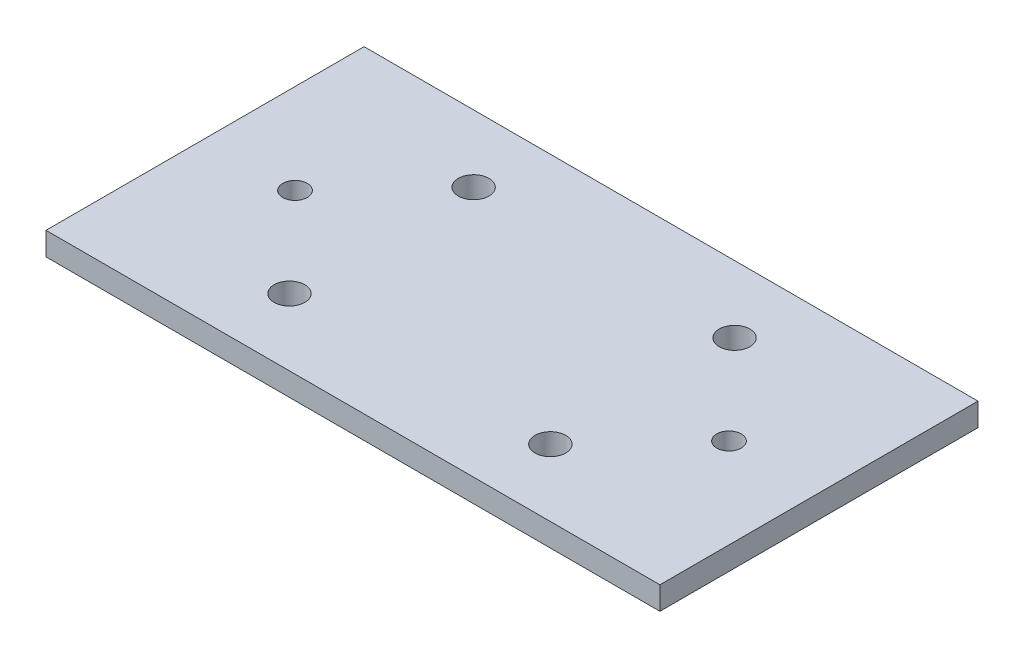
ISO-10303-21;
HEADER;
FILE_DESCRIPTION(('STEP AP214'),'2;1');
FILE_NAME('part.step','',(''),(''),'','','');
FILE_SCHEMA(('AUTOMOTIVE_DESIGN { 1 0 10303 214 1 1 1 1 }'));
ENDSEC;
DATA;
#1=APPLICATION_CONTEXT('core data for automotive mechanical design processes');
#2=APPLICATION_PROTOCOL_DEFINITION('international standard','automotive_design',2000,#1);
#3=PRODUCT_CONTEXT('',#1,'mechanical');
#4=PRODUCT('Part','Part','',(#3));
#5=PRODUCT_RELATED_PRODUCT_CATEGORY('part','',(#4));
#6=PRODUCT_DEFINITION_FORMATION('','',#4);
#7=PRODUCT_DEFINITION_CONTEXT('part definition',#1,'design');
#8=PRODUCT_DEFINITION('design','',#6,#7);
#9=PRODUCT_DEFINITION_SHAPE('','',#8);
#10=(LENGTH_UNIT() NAMED_UNIT(*) SI_UNIT(.MILLI.,.METRE.));
#11=(NAMED_UNIT(*) PLANE_ANGLE_UNIT() SI_UNIT($,.RADIAN.));
#12=(NAMED_UNIT(*) SI_UNIT($,.STERADIAN.) SOLID_ANGLE_UNIT());
#13=UNCERTAINTY_MEASURE_WITH_UNIT(LENGTH_MEASURE(1.E-05),#10,'distance_accuracy_value','');
#14=(GEOMETRIC_REPRESENTATION_CONTEXT(3) GLOBAL_UNCERTAINTY_ASSIGNED_CONTEXT((#13)) GLOBAL_UNIT_ASSIGNED_CONTEXT((#10,
#11,#12)) REPRESENTATION_CONTEXT('',''));
#15=CARTESIAN_POINT('',(0.,0.,0.));
#16=DIRECTION('',(0.,0.,1.));
#17=DIRECTION('',(1.,0.,0.));
#18=AXIS2_PLACEMENT_3D('',#15,#16,#17);
#19=CARTESIAN_POINT('',(0.,3.,0.));
#20=DIRECTION('',(0.,-1.,0.));
#21=DIRECTION('',(0.,0.,-1.));
#22=AXIS2_PLACEMENT_3D('',#19,#20,#21);
#23=PLANE('',#22);
#24=DIRECTION('',(0.,0.,1.));
#25=VECTOR('',#24,1.);
#26=CARTESIAN_POINT('',(0.,3.,0.));
#27=LINE('',#26,#25);
#28=CARTESIAN_POINT('',(0.,3.,-41.44902295419));
#29=VERTEX_POINT('',#28);
#30=CARTESIAN_POINT('',(0.,3.,0.));
#31=VERTEX_POINT('',#30);
#32=EDGE_CURVE('E96',#29,#31,#27,.T.);
#33=ORIENTED_EDGE('',*,*,#32,.T.);
#34=DIRECTION('',(1.,0.,0.));
#35=VECTOR('',#34,1.);
#36=CARTESIAN_POINT('',(0.,3.,0.));
#37=LINE('',#36,#35);
#38=CARTESIAN_POINT('',(80.,3.,0.));
#39=VERTEX_POINT('',#38);
#40=EDGE_CURVE('E91',#31,#39,#37,.T.);
#41=ORIENTED_EDGE('',*,*,#40,.T.);
#42=DIRECTION('',(0.,0.,-1.));
#43=VECTOR('',#42,1.);
#44=CARTESIAN_POINT('',(80.,3.,0.));
#45=LINE('',#44,#43);
#46=CARTESIAN_POINT('',(80.,3.,-41.44902295419));
#47=VERTEX_POINT('',#46);
#48=EDGE_CURVE('E94',#39,#47,#45,.T.);
#49=ORIENTED_EDGE('',*,*,#48,.T.);
#50=DIRECTION('',(-1.,0.,0.));
#51=VECTOR('',#50,1.);
#52=CARTESIAN_POINT('',(0.,3.,-41.44902295419));
#53=LINE('',#52,#51);
#54=EDGE_CURVE('E61',#47,#29,#53,.T.);
#55=ORIENTED_EDGE('',*,*,#54,.T.);
#56=EDGE_LOOP('',(#33,#41,#49,#55));
#57=FACE_BOUND('',#56,.T.);
#58=CARTESIAN_POINT('',(23.,3.,-32.724511477095));
#59=DIRECTION('',(0.,1.,0.));
#60=DIRECTION('',(0.,0.,1.));
#61=AXIS2_PLACEMENT_3D('',#58,#59,#60);
#62=CIRCLE('',#61,2.);
#63=CARTESIAN_POINT('',(23.,3.,-30.724511477095));
#64=VERTEX_POINT('',#63);
#65=EDGE_CURVE('E116',#64,#64,#62,.T.);
#66=ORIENTED_EDGE('',*,*,#65,.F.);
#67=EDGE_LOOP('',(#66));
#68=FACE_BOUND('',#67,.T.);
#69=CARTESIAN_POINT('',(57.,3.,-32.724511477095));
#70=DIRECTION('',(0.,1.,0.));
#71=DIRECTION('',(0.,0.,1.));
#72=AXIS2_PLACEMENT_3D('',#69,#70,#71);
#73=CIRCLE('',#72,2.);
#74=CARTESIAN_POINT('',(57.,3.,-30.724511477095));
#75=VERTEX_POINT('',#74);
#76=EDGE_CURVE('E138',#75,#75,#73,.T.);
#77=ORIENTED_EDGE('',*,*,#76,.F.);
#78=EDGE_LOOP('',(#77));
#79=FACE_BOUND('',#78,.T.);
#80=CARTESIAN_POINT('',(23.,3.,-8.72451147709501));
#81=DIRECTION('',(0.,1.,0.));
#82=DIRECTION('',(0.,0.,1.));
#83=AXIS2_PLACEMENT_3D('',#80,#81,#82);
#84=CIRCLE('',#83,2.);
#85=CARTESIAN_POINT('',(23.,3.,-6.72451147709501));
#86=VERTEX_POINT('',#85);
#87=EDGE_CURVE('E146',#86,#86,#84,.T.);
#88=ORIENTED_EDGE('',*,*,#87,.F.);
#89=EDGE_LOOP('',(#88));
#90=FACE_BOUND('',#89,.T.);
#91=CARTESIAN_POINT('',(57.,3.,-8.72451147709501));
#92=DIRECTION('',(0.,1.,0.));
#93=DIRECTION('',(0.,0.,1.));
#94=AXIS2_PLACEMENT_3D('',#91,#92,#93);
#95=CIRCLE('',#94,2.);
#96=CARTESIAN_POINT('',(57.,3.,-6.72451147709501));
#97=VERTEX_POINT('',#96);
#98=EDGE_CURVE('E154',#97,#97,#95,.T.);
#99=ORIENTED_EDGE('',*,*,#98,.F.);
#100=EDGE_LOOP('',(#99));
#101=FACE_BOUND('',#100,.T.);
#102=CARTESIAN_POINT('',(11.725819633535,3.,-20.724511477095));
#103=DIRECTION('',(0.,1.,0.));
#104=DIRECTION('',(0.,0.,1.));
#105=AXIS2_PLACEMENT_3D('',#102,#103,#104);
#106=CIRCLE('',#105,1.6);
#107=CARTESIAN_POINT('',(11.725819633535,3.,-19.124511477095));
#108=VERTEX_POINT('',#107);
#109=EDGE_CURVE('E162',#108,#108,#106,.T.);
#110=ORIENTED_EDGE('',*,*,#109,.F.);
#111=EDGE_LOOP('',(#110));
#112=FACE_BOUND('',#111,.T.);
#113=CARTESIAN_POINT('',(68.274180366465,3.,-20.724511477095));
#114=DIRECTION('',(0.,1.,0.));
#115=DIRECTION('',(0.,0.,1.));
#116=AXIS2_PLACEMENT_3D('',#113,#114,#115);
#117=CIRCLE('',#116,1.6);
#118=CARTESIAN_POINT('',(68.274180366465,3.,-19.124511477095));
#119=VERTEX_POINT('',#118);
#120=EDGE_CURVE('E170',#119,#119,#117,.T.);
#121=ORIENTED_EDGE('',*,*,#120,.F.);
#122=EDGE_LOOP('',(#121));
#123=FACE_BOUND('',#122,.T.);
#124=ADVANCED_FACE('F43',(#57,#68,#79,#90,#101,#112,#123),#23,.F.);
#125=CARTESIAN_POINT('',(0.,0.,0.));
#126=DIRECTION('',(0.,-1.,0.));
#127=DIRECTION('',(0.,0.,-1.));
#128=AXIS2_PLACEMENT_3D('',#125,#126,#127);
#129=PLANE('',#128);
#130=CARTESIAN_POINT('',(11.725819633535,0.,-20.724511477095));
#131=DIRECTION('',(0.,1.,0.));
#132=DIRECTION('',(0.,0.,1.));
#133=AXIS2_PLACEMENT_3D('',#130,#131,#132);
#134=CIRCLE('',#133,1.6);
#135=CARTESIAN_POINT('',(11.725819633535,0.,-19.124511477095));
#136=VERTEX_POINT('',#135);
#137=EDGE_CURVE('E166',#136,#136,#134,.T.);
#138=ORIENTED_EDGE('',*,*,#137,.T.);
#139=EDGE_LOOP('',(#138));
#140=FACE_BOUND('',#139,.T.);
#141=CARTESIAN_POINT('',(23.,0.,-8.72451147709501));
#142=DIRECTION('',(0.,1.,0.));
#143=DIRECTION('',(0.,0.,1.));
#144=AXIS2_PLACEMENT_3D('',#141,#142,#143);
#145=CIRCLE('',#144,2.);
#146=CARTESIAN_POINT('',(23.,0.,-6.72451147709501));
#147=VERTEX_POINT('',#146);
#148=EDGE_CURVE('E150',#147,#147,#145,.T.);
#149=ORIENTED_EDGE('',*,*,#148,.T.);
#150=EDGE_LOOP('',(#149));
#151=FACE_BOUND('',#150,.T.);
#152=CARTESIAN_POINT('',(23.,0.,-32.724511477095));
#153=DIRECTION('',(0.,1.,0.));
#154=DIRECTION('',(0.,0.,1.));
#155=AXIS2_PLACEMENT_3D('',#152,#153,#154);
#156=CIRCLE('',#155,2.);
#157=CARTESIAN_POINT('',(23.,0.,-30.724511477095));
#158=VERTEX_POINT('',#157);
#159=EDGE_CURVE('E134',#158,#158,#156,.T.);
#160=ORIENTED_EDGE('',*,*,#159,.T.);
#161=EDGE_LOOP('',(#160));
#162=FACE_BOUND('',#161,.T.);
#163=DIRECTION('',(0.,0.,1.));
#164=VECTOR('',#163,1.);
#165=CARTESIAN_POINT('',(0.,0.,0.));
#166=LINE('',#165,#164);
#167=CARTESIAN_POINT('',(0.,0.,-41.44902295419));
#168=VERTEX_POINT('',#167);
#169=CARTESIAN_POINT('',(0.,0.,0.));
#170=VERTEX_POINT('',#169);
#171=EDGE_CURVE('E112',#168,#170,#166,.T.);
#172=ORIENTED_EDGE('',*,*,#171,.F.);
#173=DIRECTION('',(-1.,0.,0.));
#174=VECTOR('',#173,1.);
#175=CARTESIAN_POINT('',(0.,0.,-41.44902295419));
#176=LINE('',#175,#174);
#177=CARTESIAN_POINT('',(80.,0.,-41.44902295419));
#178=VERTEX_POINT('',#177);
#179=EDGE_CURVE('E84',#178,#168,#176,.T.);
#180=ORIENTED_EDGE('',*,*,#179,.F.);
#181=DIRECTION('',(0.,0.,-1.));
#182=VECTOR('',#181,1.);
#183=CARTESIAN_POINT('',(80.,0.,0.));
#184=LINE('',#183,#182);
#185=CARTESIAN_POINT('',(80.,0.,0.));
#186=VERTEX_POINT('',#185);
#187=EDGE_CURVE('E78',#186,#178,#184,.T.);
#188=ORIENTED_EDGE('',*,*,#187,.F.);
#189=DIRECTION('',(1.,0.,0.));
#190=VECTOR('',#189,1.);
#191=CARTESIAN_POINT('',(0.,0.,0.));
#192=LINE('',#191,#190);
#193=EDGE_CURVE('E101',#170,#186,#192,.T.);
#194=ORIENTED_EDGE('',*,*,#193,.F.);
#195=EDGE_LOOP('',(#172,#180,#188,#194));
#196=FACE_BOUND('',#195,.T.);
#197=CARTESIAN_POINT('',(57.,0.,-32.724511477095));
#198=DIRECTION('',(0.,1.,0.));
#199=DIRECTION('',(0.,0.,1.));
#200=AXIS2_PLACEMENT_3D('',#197,#198,#199);
#201=CIRCLE('',#200,2.);
#202=CARTESIAN_POINT('',(57.,0.,-30.724511477095));
#203=VERTEX_POINT('',#202);
#204=EDGE_CURVE('E142',#203,#203,#201,.T.);
#205=ORIENTED_EDGE('',*,*,#204,.T.);
#206=EDGE_LOOP('',(#205));
#207=FACE_BOUND('',#206,.T.);
#208=CARTESIAN_POINT('',(57.,0.,-8.72451147709501));
#209=DIRECTION('',(0.,1.,0.));
#210=DIRECTION('',(0.,0.,1.));
#211=AXIS2_PLACEMENT_3D('',#208,#209,#210);
#212=CIRCLE('',#211,2.);
#213=CARTESIAN_POINT('',(57.,0.,-6.72451147709501));
#214=VERTEX_POINT('',#213);
#215=EDGE_CURVE('E158',#214,#214,#212,.T.);
#216=ORIENTED_EDGE('',*,*,#215,.T.);
#217=EDGE_LOOP('',(#216));
#218=FACE_BOUND('',#217,.T.);
#219=CARTESIAN_POINT('',(68.274180366465,0.,-20.724511477095));
#220=DIRECTION('',(0.,1.,0.));
#221=DIRECTION('',(0.,0.,1.));
#222=AXIS2_PLACEMENT_3D('',#219,#220,#221);
#223=CIRCLE('',#222,1.6);
#224=CARTESIAN_POINT('',(68.274180366465,0.,-19.124511477095));
#225=VERTEX_POINT('',#224);
#226=EDGE_CURVE('E174',#225,#225,#223,.T.);
#227=ORIENTED_EDGE('',*,*,#226,.T.);
#228=EDGE_LOOP('',(#227));
#229=FACE_BOUND('',#228,.T.);
#230=ADVANCED_FACE('F129',(#140,#151,#162,#196,#207,#218,#229),#129,.T.);
#231=CARTESIAN_POINT('',(0.,3.,0.));
#232=DIRECTION('',(1.,0.,0.));
#233=DIRECTION('',(0.,0.,-1.));
#234=AXIS2_PLACEMENT_3D('',#231,#232,#233);
#235=PLANE('',#234);
#236=ORIENTED_EDGE('',*,*,#171,.T.);
#237=DIRECTION('',(0.,-1.,0.));
#238=VECTOR('',#237,1.);
#239=CARTESIAN_POINT('',(0.,3.,0.));
#240=LINE('',#239,#238);
#241=EDGE_CURVE('E11',#31,#170,#240,.T.);
#242=ORIENTED_EDGE('',*,*,#241,.F.);
#243=ORIENTED_EDGE('',*,*,#32,.F.);
#244=DIRECTION('',(0.,-1.,0.));
#245=VECTOR('',#244,1.);
#246=CARTESIAN_POINT('',(0.,3.,-41.44902295419));
#247=LINE('',#246,#245);
#248=EDGE_CURVE('E108',#29,#168,#247,.T.);
#249=ORIENTED_EDGE('',*,*,#248,.T.);
#250=EDGE_LOOP('',(#236,#242,#243,#249));
#251=FACE_BOUND('',#250,.T.);
#252=ADVANCED_FACE('F45',(#251),#235,.F.);
#253=CARTESIAN_POINT('',(0.,3.,0.));
#254=DIRECTION('',(0.,0.,-1.));
#255=DIRECTION('',(-1.,0.,0.));
#256=AXIS2_PLACEMENT_3D('',#253,#254,#255);
#257=PLANE('',#256);
#258=ORIENTED_EDGE('',*,*,#193,.T.);
#259=DIRECTION('',(0.,-1.,0.));
#260=VECTOR('',#259,1.);
#261=CARTESIAN_POINT('',(80.,3.,0.));
#262=LINE('',#261,#260);
#263=EDGE_CURVE('E53',#39,#186,#262,.T.);
#264=ORIENTED_EDGE('',*,*,#263,.F.);
#265=ORIENTED_EDGE('',*,*,#40,.F.);
#266=ORIENTED_EDGE('',*,*,#241,.T.);
#267=EDGE_LOOP('',(#258,#264,#265,#266));
#268=FACE_BOUND('',#267,.T.);
#269=ADVANCED_FACE('F100',(#268),#257,.F.);
#270=CARTESIAN_POINT('',(80.,3.,0.));
#271=DIRECTION('',(-1.,0.,0.));
#272=DIRECTION('',(0.,0.,1.));
#273=AXIS2_PLACEMENT_3D('',#270,#271,#272);
#274=PLANE('',#273);
#275=ORIENTED_EDGE('',*,*,#187,.T.);
#276=DIRECTION('',(0.,-1.,0.));
#277=VECTOR('',#276,1.);
#278=CARTESIAN_POINT('',(80.,3.,-41.44902295419));
#279=LINE('',#278,#277);
#280=EDGE_CURVE('E103',#47,#178,#279,.T.);
#281=ORIENTED_EDGE('',*,*,#280,.F.);
#282=ORIENTED_EDGE('',*,*,#48,.F.);
#283=ORIENTED_EDGE('',*,*,#263,.T.);
#284=EDGE_LOOP('',(#275,#281,#282,#283));
#285=FACE_BOUND('',#284,.T.);
#286=ADVANCED_FACE('F104',(#285),#274,.F.);
#287=CARTESIAN_POINT('',(0.,3.,-41.44902295419));
#288=DIRECTION('',(0.,0.,1.));
#289=DIRECTION('',(1.,0.,0.));
#290=AXIS2_PLACEMENT_3D('',#287,#288,#289);
#291=PLANE('',#290);
#292=ORIENTED_EDGE('',*,*,#179,.T.);
#293=ORIENTED_EDGE('',*,*,#248,.F.);
#294=ORIENTED_EDGE('',*,*,#54,.F.);
#295=ORIENTED_EDGE('',*,*,#280,.T.);
#296=EDGE_LOOP('',(#292,#293,#294,#295));
#297=FACE_BOUND('',#296,.T.);
#298=ADVANCED_FACE('F126',(#297),#291,.F.);
#299=CARTESIAN_POINT('',(23.,3.,-32.724511477095));
#300=DIRECTION('',(0.,-1.,0.));
#301=DIRECTION('',(0.,0.,-1.));
#302=AXIS2_PLACEMENT_3D('',#299,#300,#301);
#303=CYLINDRICAL_SURFACE('',#302,2.);
#304=ORIENTED_EDGE('',*,*,#65,.T.);
#305=EDGE_LOOP('',(#304));
#306=FACE_BOUND('',#305,.T.);
#307=ORIENTED_EDGE('',*,*,#159,.F.);
#308=EDGE_LOOP('',(#307));
#309=FACE_BOUND('',#308,.T.);
#310=ADVANCED_FACE('F193',(#306,#309),#303,.F.);
#311=CARTESIAN_POINT('',(57.,3.,-32.724511477095));
#312=DIRECTION('',(0.,-1.,0.));
#313=DIRECTION('',(0.,0.,-1.));
#314=AXIS2_PLACEMENT_3D('',#311,#312,#313);
#315=CYLINDRICAL_SURFACE('',#314,2.);
#316=ORIENTED_EDGE('',*,*,#76,.T.);
#317=EDGE_LOOP('',(#316));
#318=FACE_BOUND('',#317,.T.);
#319=ORIENTED_EDGE('',*,*,#204,.F.);
#320=EDGE_LOOP('',(#319));
#321=FACE_BOUND('',#320,.T.);
#322=ADVANCED_FACE('F247',(#318,#321),#315,.F.);
#323=CARTESIAN_POINT('',(23.,3.,-8.72451147709501));
#324=DIRECTION('',(0.,-1.,0.));
#325=DIRECTION('',(0.,0.,-1.));
#326=AXIS2_PLACEMENT_3D('',#323,#324,#325);
#327=CYLINDRICAL_SURFACE('',#326,2.);
#328=ORIENTED_EDGE('',*,*,#87,.T.);
#329=EDGE_LOOP('',(#328));
#330=FACE_BOUND('',#329,.T.);
#331=ORIENTED_EDGE('',*,*,#148,.F.);
#332=EDGE_LOOP('',(#331));
#333=FACE_BOUND('',#332,.T.);
#334=ADVANCED_FACE('F256',(#330,#333),#327,.F.);
#335=CARTESIAN_POINT('',(57.,3.,-8.72451147709501));
#336=DIRECTION('',(0.,-1.,0.));
#337=DIRECTION('',(0.,0.,-1.));
#338=AXIS2_PLACEMENT_3D('',#335,#336,#337);
#339=CYLINDRICAL_SURFACE('',#338,2.);
#340=ORIENTED_EDGE('',*,*,#98,.T.);
#341=EDGE_LOOP('',(#340));
#342=FACE_BOUND('',#341,.T.);
#343=ORIENTED_EDGE('',*,*,#215,.F.);
#344=EDGE_LOOP('',(#343));
#345=FACE_BOUND('',#344,.T.);
#346=ADVANCED_FACE('F265',(#342,#345),#339,.F.);
#347=CARTESIAN_POINT('',(11.725819633535,3.,-20.724511477095));
#348=DIRECTION('',(0.,-1.,0.));
#349=DIRECTION('',(0.,0.,-1.));
#350=AXIS2_PLACEMENT_3D('',#347,#348,#349);
#351=CYLINDRICAL_SURFACE('',#350,1.6);
#352=ORIENTED_EDGE('',*,*,#109,.T.);
#353=EDGE_LOOP('',(#352));
#354=FACE_BOUND('',#353,.T.);
#355=ORIENTED_EDGE('',*,*,#137,.F.);
#356=EDGE_LOOP('',(#355));
#357=FACE_BOUND('',#356,.T.);
#358=ADVANCED_FACE('F275',(#354,#357),#351,.F.);
#359=CARTESIAN_POINT('',(68.274180366465,3.,-20.724511477095));
#360=DIRECTION('',(0.,-1.,0.));
#361=DIRECTION('',(0.,0.,-1.));
#362=AXIS2_PLACEMENT_3D('',#359,#360,#361);
#363=CYLINDRICAL_SURFACE('',#362,1.6);
#364=ORIENTED_EDGE('',*,*,#120,.T.);
#365=EDGE_LOOP('',(#364));
#366=FACE_BOUND('',#365,.T.);
#367=ORIENTED_EDGE('',*,*,#226,.F.);
#368=EDGE_LOOP('',(#367));
#369=FACE_BOUND('',#368,.T.);
#370=ADVANCED_FACE('F182',(#366,#369),#363,.F.);
#371=CLOSED_SHELL('',(#124,#230,#252,#269,#286,#298,#310,#322,#334,#346,#358,#370));
#372=MANIFOLD_SOLID_BREP('B2',#371);
#373=ADVANCED_BREP_SHAPE_REPRESENTATION('',(#18,#372),#14);
#374=SHAPE_DEFINITION_REPRESENTATION(#9,#373);
ENDSEC;
END-ISO-10303-21;
